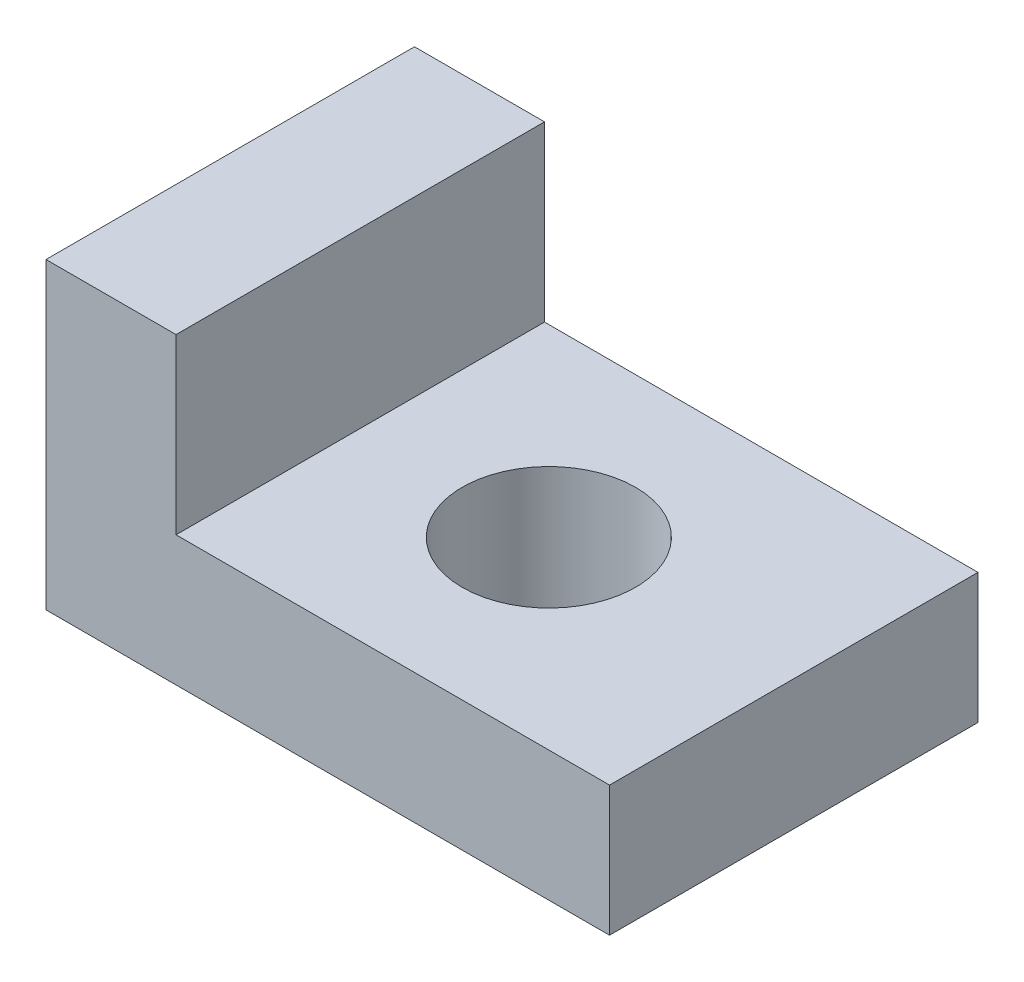
ISO-10303-21;
HEADER;
FILE_DESCRIPTION(('STEP AP214'),'2;1');
FILE_NAME('part.step','',(''),(''),'','','');
FILE_SCHEMA(('AUTOMOTIVE_DESIGN { 1 0 10303 214 1 1 1 1 }'));
ENDSEC;
DATA;
#1=APPLICATION_CONTEXT('core data for automotive mechanical design processes');
#2=APPLICATION_PROTOCOL_DEFINITION('international standard','automotive_design',2000,#1);
#3=PRODUCT_CONTEXT('',#1,'mechanical');
#4=PRODUCT('Part','Part','',(#3));
#5=PRODUCT_RELATED_PRODUCT_CATEGORY('part','',(#4));
#6=PRODUCT_DEFINITION_FORMATION('','',#4);
#7=PRODUCT_DEFINITION_CONTEXT('part definition',#1,'design');
#8=PRODUCT_DEFINITION('design','',#6,#7);
#9=PRODUCT_DEFINITION_SHAPE('','',#8);
#10=(LENGTH_UNIT() NAMED_UNIT(*) SI_UNIT(.MILLI.,.METRE.));
#11=(NAMED_UNIT(*) PLANE_ANGLE_UNIT() SI_UNIT($,.RADIAN.));
#12=(NAMED_UNIT(*) SI_UNIT($,.STERADIAN.) SOLID_ANGLE_UNIT());
#13=UNCERTAINTY_MEASURE_WITH_UNIT(LENGTH_MEASURE(1.E-05),#10,'distance_accuracy_value','');
#14=(GEOMETRIC_REPRESENTATION_CONTEXT(3) GLOBAL_UNCERTAINTY_ASSIGNED_CONTEXT((#13)) GLOBAL_UNIT_ASSIGNED_CONTEXT((#10,
#11,#12)) REPRESENTATION_CONTEXT('',''));
#15=CARTESIAN_POINT('',(0.,0.,0.));
#16=DIRECTION('',(0.,0.,1.));
#17=DIRECTION('',(1.,0.,0.));
#18=AXIS2_PLACEMENT_3D('',#15,#16,#17);
#19=CARTESIAN_POINT('',(0.,3.,0.));
#20=DIRECTION('',(0.,-1.,0.));
#21=DIRECTION('',(0.,0.,-1.));
#22=AXIS2_PLACEMENT_3D('',#19,#20,#21);
#23=PLANE('',#22);
#24=CARTESIAN_POINT('',(0.85,3.,0.));
#25=DIRECTION('',(0.,1.,0.));
#26=DIRECTION('',(0.,0.,1.));
#27=AXIS2_PLACEMENT_3D('',#24,#25,#26);
#28=CIRCLE('',#27,2.);
#29=CARTESIAN_POINT('',(0.85,3.,2.));
#30=VERTEX_POINT('',#29);
#31=EDGE_CURVE('E118',#30,#30,#28,.T.);
#32=ORIENTED_EDGE('',*,*,#31,.F.);
#33=EDGE_LOOP('',(#32));
#34=FACE_BOUND('',#33,.T.);
#35=DIRECTION('',(0.,0.,-1.));
#36=VECTOR('',#35,1.);
#37=CARTESIAN_POINT('',(-3.5,3.,-4.25));
#38=LINE('',#37,#36);
#39=CARTESIAN_POINT('',(-3.5,3.,4.25));
#40=VERTEX_POINT('',#39);
#41=CARTESIAN_POINT('',(-3.5,3.,-4.25));
#42=VERTEX_POINT('',#41);
#43=EDGE_CURVE('E61',#40,#42,#38,.T.);
#44=ORIENTED_EDGE('',*,*,#43,.F.);
#45=DIRECTION('',(1.,0.,0.));
#46=VECTOR('',#45,1.);
#47=CARTESIAN_POINT('',(-6.5,3.,4.25));
#48=LINE('',#47,#46);
#49=CARTESIAN_POINT('',(6.5,3.,4.25));
#50=VERTEX_POINT('',#49);
#51=EDGE_CURVE('E100',#40,#50,#48,.T.);
#52=ORIENTED_EDGE('',*,*,#51,.T.);
#53=DIRECTION('',(0.,0.,1.));
#54=VECTOR('',#53,1.);
#55=CARTESIAN_POINT('',(6.5,3.,-4.25));
#56=LINE('',#55,#54);
#57=CARTESIAN_POINT('',(6.5,3.,-4.25));
#58=VERTEX_POINT('',#57);
#59=EDGE_CURVE('E138',#58,#50,#56,.T.);
#60=ORIENTED_EDGE('',*,*,#59,.F.);
#61=DIRECTION('',(1.,0.,0.));
#62=VECTOR('',#61,1.);
#63=CARTESIAN_POINT('',(-6.5,3.,-4.25));
#64=LINE('',#63,#62);
#65=EDGE_CURVE('E69',#42,#58,#64,.T.);
#66=ORIENTED_EDGE('',*,*,#65,.F.);
#67=EDGE_LOOP('',(#44,#52,#60,#66));
#68=FACE_BOUND('',#67,.T.);
#69=ADVANCED_FACE('F45',(#34,#68),#23,.F.);
#70=CARTESIAN_POINT('',(-6.5,3.,4.25));
#71=DIRECTION('',(0.,0.,-1.));
#72=DIRECTION('',(-1.,0.,0.));
#73=AXIS2_PLACEMENT_3D('',#70,#71,#72);
#74=PLANE('',#73);
#75=DIRECTION('',(1.,0.,0.));
#76=VECTOR('',#75,1.);
#77=CARTESIAN_POINT('',(-6.5,0.,4.25));
#78=LINE('',#77,#76);
#79=CARTESIAN_POINT('',(-6.5,0.,4.25));
#80=VERTEX_POINT('',#79);
#81=CARTESIAN_POINT('',(6.5,0.,4.25));
#82=VERTEX_POINT('',#81);
#83=EDGE_CURVE('E106',#80,#82,#78,.T.);
#84=ORIENTED_EDGE('',*,*,#83,.T.);
#85=DIRECTION('',(0.,-1.,0.));
#86=VECTOR('',#85,1.);
#87=CARTESIAN_POINT('',(6.5,3.,4.25));
#88=LINE('',#87,#86);
#89=EDGE_CURVE('E11',#50,#82,#88,.T.);
#90=ORIENTED_EDGE('',*,*,#89,.F.);
#91=ORIENTED_EDGE('',*,*,#51,.F.);
#92=DIRECTION('',(0.,-1.,0.));
#93=VECTOR('',#92,1.);
#94=CARTESIAN_POINT('',(-3.5,7.,4.25));
#95=LINE('',#94,#93);
#96=CARTESIAN_POINT('',(-3.5,7.,4.25));
#97=VERTEX_POINT('',#96);
#98=EDGE_CURVE('E141',#97,#40,#95,.T.);
#99=ORIENTED_EDGE('',*,*,#98,.F.);
#100=DIRECTION('',(1.,0.,0.));
#101=VECTOR('',#100,1.);
#102=CARTESIAN_POINT('',(-6.5,7.,4.25));
#103=LINE('',#102,#101);
#104=CARTESIAN_POINT('',(-6.5,7.,4.25));
#105=VERTEX_POINT('',#104);
#106=EDGE_CURVE('E110',#105,#97,#103,.T.);
#107=ORIENTED_EDGE('',*,*,#106,.F.);
#108=DIRECTION('',(0.,-1.,0.));
#109=VECTOR('',#108,1.);
#110=CARTESIAN_POINT('',(-6.5,3.,4.25));
#111=LINE('',#110,#109);
#112=EDGE_CURVE('E91',#105,#80,#111,.T.);
#113=ORIENTED_EDGE('',*,*,#112,.T.);
#114=EDGE_LOOP('',(#84,#90,#91,#99,#107,#113));
#115=FACE_BOUND('',#114,.T.);
#116=ADVANCED_FACE('F47',(#115),#74,.F.);
#117=CARTESIAN_POINT('',(6.5,3.,-4.25));
#118=DIRECTION('',(1.,0.,0.));
#119=DIRECTION('',(0.,0.,-1.));
#120=AXIS2_PLACEMENT_3D('',#117,#118,#119);
#121=PLANE('',#120);
#122=DIRECTION('',(0.,0.,1.));
#123=VECTOR('',#122,1.);
#124=CARTESIAN_POINT('',(6.5,0.,-4.25));
#125=LINE('',#124,#123);
#126=CARTESIAN_POINT('',(6.5,0.,-4.25));
#127=VERTEX_POINT('',#126);
#128=EDGE_CURVE('E116',#127,#82,#125,.T.);
#129=ORIENTED_EDGE('',*,*,#128,.F.);
#130=DIRECTION('',(0.,-1.,0.));
#131=VECTOR('',#130,1.);
#132=CARTESIAN_POINT('',(6.5,3.,-4.25));
#133=LINE('',#132,#131);
#134=EDGE_CURVE('E54',#58,#127,#133,.T.);
#135=ORIENTED_EDGE('',*,*,#134,.F.);
#136=ORIENTED_EDGE('',*,*,#59,.T.);
#137=ORIENTED_EDGE('',*,*,#89,.T.);
#138=EDGE_LOOP('',(#129,#135,#136,#137));
#139=FACE_BOUND('',#138,.T.);
#140=ADVANCED_FACE('F137',(#139),#121,.T.);
#141=CARTESIAN_POINT('',(-6.5,3.,-4.25));
#142=DIRECTION('',(0.,0.,-1.));
#143=DIRECTION('',(-1.,0.,0.));
#144=AXIS2_PLACEMENT_3D('',#141,#142,#143);
#145=PLANE('',#144);
#146=DIRECTION('',(1.,0.,0.));
#147=VECTOR('',#146,1.);
#148=CARTESIAN_POINT('',(-6.5,0.,-4.25));
#149=LINE('',#148,#147);
#150=CARTESIAN_POINT('',(-6.5,0.,-4.25));
#151=VERTEX_POINT('',#150);
#152=EDGE_CURVE('E101',#151,#127,#149,.T.);
#153=ORIENTED_EDGE('',*,*,#152,.F.);
#154=DIRECTION('',(0.,-1.,0.));
#155=VECTOR('',#154,1.);
#156=CARTESIAN_POINT('',(-6.5,3.,-4.25));
#157=LINE('',#156,#155);
#158=CARTESIAN_POINT('',(-6.5,7.,-4.25));
#159=VERTEX_POINT('',#158);
#160=EDGE_CURVE('E94',#159,#151,#157,.T.);
#161=ORIENTED_EDGE('',*,*,#160,.F.);
#162=DIRECTION('',(-1.,0.,0.));
#163=VECTOR('',#162,1.);
#164=CARTESIAN_POINT('',(-6.5,7.,-4.25));
#165=LINE('',#164,#163);
#166=CARTESIAN_POINT('',(-3.5,7.,-4.25));
#167=VERTEX_POINT('',#166);
#168=EDGE_CURVE('E158',#167,#159,#165,.T.);
#169=ORIENTED_EDGE('',*,*,#168,.F.);
#170=DIRECTION('',(0.,-1.,0.));
#171=VECTOR('',#170,1.);
#172=CARTESIAN_POINT('',(-3.5,7.,-4.25));
#173=LINE('',#172,#171);
#174=EDGE_CURVE('E152',#167,#42,#173,.T.);
#175=ORIENTED_EDGE('',*,*,#174,.T.);
#176=ORIENTED_EDGE('',*,*,#65,.T.);
#177=ORIENTED_EDGE('',*,*,#134,.T.);
#178=EDGE_LOOP('',(#153,#161,#169,#175,#176,#177));
#179=FACE_BOUND('',#178,.T.);
#180=ADVANCED_FACE('F133',(#179),#145,.T.);
#181=CARTESIAN_POINT('',(-6.5,3.,-4.25));
#182=DIRECTION('',(1.,0.,0.));
#183=DIRECTION('',(0.,0.,-1.));
#184=AXIS2_PLACEMENT_3D('',#181,#182,#183);
#185=PLANE('',#184);
#186=DIRECTION('',(0.,0.,1.));
#187=VECTOR('',#186,1.);
#188=CARTESIAN_POINT('',(-6.5,0.,-4.25));
#189=LINE('',#188,#187);
#190=EDGE_CURVE('E86',#151,#80,#189,.T.);
#191=ORIENTED_EDGE('',*,*,#190,.T.);
#192=ORIENTED_EDGE('',*,*,#112,.F.);
#193=DIRECTION('',(0.,0.,1.));
#194=VECTOR('',#193,1.);
#195=CARTESIAN_POINT('',(-6.5,7.,-4.25));
#196=LINE('',#195,#194);
#197=EDGE_CURVE('E165',#159,#105,#196,.T.);
#198=ORIENTED_EDGE('',*,*,#197,.F.);
#199=ORIENTED_EDGE('',*,*,#160,.T.);
#200=EDGE_LOOP('',(#191,#192,#198,#199));
#201=FACE_BOUND('',#200,.T.);
#202=ADVANCED_FACE('F88',(#201),#185,.F.);
#203=CARTESIAN_POINT('',(0.,0.,0.));
#204=DIRECTION('',(0.,-1.,0.));
#205=DIRECTION('',(0.,0.,-1.));
#206=AXIS2_PLACEMENT_3D('',#203,#204,#205);
#207=PLANE('',#206);
#208=CARTESIAN_POINT('',(0.85,0.,0.));
#209=DIRECTION('',(0.,1.,0.));
#210=DIRECTION('',(0.,0.,1.));
#211=AXIS2_PLACEMENT_3D('',#208,#209,#210);
#212=CIRCLE('',#211,2.);
#213=CARTESIAN_POINT('',(0.85,0.,2.));
#214=VERTEX_POINT('',#213);
#215=EDGE_CURVE('E124',#214,#214,#212,.T.);
#216=ORIENTED_EDGE('',*,*,#215,.T.);
#217=EDGE_LOOP('',(#216));
#218=FACE_BOUND('',#217,.T.);
#219=ORIENTED_EDGE('',*,*,#83,.F.);
#220=ORIENTED_EDGE('',*,*,#190,.F.);
#221=ORIENTED_EDGE('',*,*,#152,.T.);
#222=ORIENTED_EDGE('',*,*,#128,.T.);
#223=EDGE_LOOP('',(#219,#220,#221,#222));
#224=FACE_BOUND('',#223,.T.);
#225=ADVANCED_FACE('F114',(#218,#224),#207,.T.);
#226=CARTESIAN_POINT('',(0.85,3.,0.));
#227=DIRECTION('',(0.,-1.,0.));
#228=DIRECTION('',(0.,0.,-1.));
#229=AXIS2_PLACEMENT_3D('',#226,#227,#228);
#230=CYLINDRICAL_SURFACE('',#229,2.);
#231=ORIENTED_EDGE('',*,*,#31,.T.);
#232=EDGE_LOOP('',(#231));
#233=FACE_BOUND('',#232,.T.);
#234=ORIENTED_EDGE('',*,*,#215,.F.);
#235=EDGE_LOOP('',(#234));
#236=FACE_BOUND('',#235,.T.);
#237=ADVANCED_FACE('F192',(#233,#236),#230,.F.);
#238=CARTESIAN_POINT('',(-3.5,7.,-4.25));
#239=DIRECTION('',(-1.,0.,0.));
#240=DIRECTION('',(0.,0.,1.));
#241=AXIS2_PLACEMENT_3D('',#238,#239,#240);
#242=PLANE('',#241);
#243=ORIENTED_EDGE('',*,*,#43,.T.);
#244=ORIENTED_EDGE('',*,*,#174,.F.);
#245=DIRECTION('',(0.,0.,-1.));
#246=VECTOR('',#245,1.);
#247=CARTESIAN_POINT('',(-3.5,7.,-4.25));
#248=LINE('',#247,#246);
#249=EDGE_CURVE('E150',#97,#167,#248,.T.);
#250=ORIENTED_EDGE('',*,*,#249,.F.);
#251=ORIENTED_EDGE('',*,*,#98,.T.);
#252=EDGE_LOOP('',(#243,#244,#250,#251));
#253=FACE_BOUND('',#252,.T.);
#254=ADVANCED_FACE('F146',(#253),#242,.F.);
#255=CARTESIAN_POINT('',(0.,7.,0.));
#256=DIRECTION('',(0.,1.,0.));
#257=DIRECTION('',(0.,0.,1.));
#258=AXIS2_PLACEMENT_3D('',#255,#256,#257);
#259=PLANE('',#258);
#260=ORIENTED_EDGE('',*,*,#197,.T.);
#261=ORIENTED_EDGE('',*,*,#106,.T.);
#262=ORIENTED_EDGE('',*,*,#249,.T.);
#263=ORIENTED_EDGE('',*,*,#168,.T.);
#264=EDGE_LOOP('',(#260,#261,#262,#263));
#265=FACE_BOUND('',#264,.T.);
#266=ADVANCED_FACE('F175',(#265),#259,.T.);
#267=CLOSED_SHELL('',(#69,#116,#140,#180,#202,#225,#237,#254,#266));
#268=MANIFOLD_SOLID_BREP('B2',#267);
#269=ADVANCED_BREP_SHAPE_REPRESENTATION('',(#18,#268),#14);
#270=SHAPE_DEFINITION_REPRESENTATION(#9,#269);
ENDSEC;
END-ISO-10303-21;
